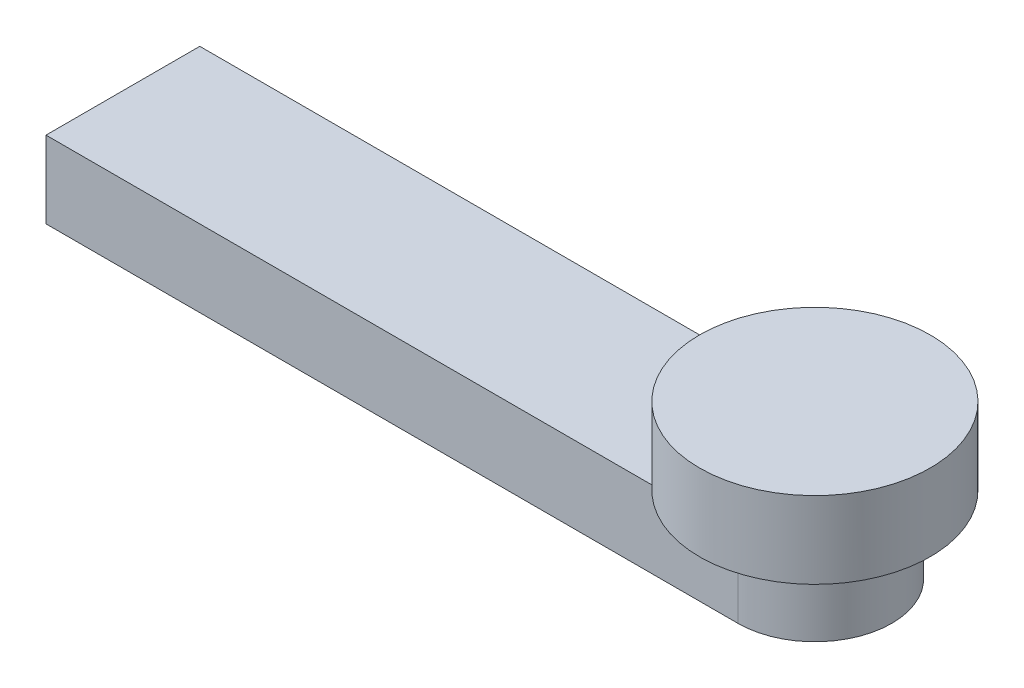
ISO-10303-21;
HEADER;
FILE_DESCRIPTION(('STEP AP214'),'2;1');
FILE_NAME('part.step','',(''),(''),'','','');
FILE_SCHEMA(('AUTOMOTIVE_DESIGN { 1 0 10303 214 1 1 1 1 }'));
ENDSEC;
DATA;
#1=APPLICATION_CONTEXT('core data for automotive mechanical design processes');
#2=APPLICATION_PROTOCOL_DEFINITION('international standard','automotive_design',2000,#1);
#3=PRODUCT_CONTEXT('',#1,'mechanical');
#4=PRODUCT('Part','Part','',(#3));
#5=PRODUCT_RELATED_PRODUCT_CATEGORY('part','',(#4));
#6=PRODUCT_DEFINITION_FORMATION('','',#4);
#7=PRODUCT_DEFINITION_CONTEXT('part definition',#1,'design');
#8=PRODUCT_DEFINITION('design','',#6,#7);
#9=PRODUCT_DEFINITION_SHAPE('','',#8);
#10=(LENGTH_UNIT() NAMED_UNIT(*) SI_UNIT(.MILLI.,.METRE.));
#11=(NAMED_UNIT(*) PLANE_ANGLE_UNIT() SI_UNIT($,.RADIAN.));
#12=(NAMED_UNIT(*) SI_UNIT($,.STERADIAN.) SOLID_ANGLE_UNIT());
#13=UNCERTAINTY_MEASURE_WITH_UNIT(LENGTH_MEASURE(1.E-05),#10,'distance_accuracy_value','');
#14=(GEOMETRIC_REPRESENTATION_CONTEXT(3) GLOBAL_UNCERTAINTY_ASSIGNED_CONTEXT((#13)) GLOBAL_UNIT_ASSIGNED_CONTEXT((#10,
#11,#12)) REPRESENTATION_CONTEXT('',''));
#15=CARTESIAN_POINT('',(0.,0.,0.));
#16=DIRECTION('',(0.,0.,1.));
#17=DIRECTION('',(1.,0.,0.));
#18=AXIS2_PLACEMENT_3D('',#15,#16,#17);
#19=CARTESIAN_POINT('',(45.,10.,0.));
#20=DIRECTION('',(0.,-1.,0.));
#21=DIRECTION('',(0.,0.,-1.));
#22=AXIS2_PLACEMENT_3D('',#19,#20,#21);
#23=CYLINDRICAL_SURFACE('',#22,10.);
#24=CARTESIAN_POINT('',(45.,0.,0.));
#25=DIRECTION('',(0.,1.,0.));
#26=DIRECTION('',(0.,0.,1.));
#27=AXIS2_PLACEMENT_3D('',#24,#25,#26);
#28=CIRCLE('',#27,10.);
#29=CARTESIAN_POINT('',(45.,0.,10.));
#30=VERTEX_POINT('',#29);
#31=CARTESIAN_POINT('',(45.,0.,-10.));
#32=VERTEX_POINT('',#31);
#33=EDGE_CURVE('E119',#30,#32,#28,.T.);
#34=ORIENTED_EDGE('',*,*,#33,.T.);
#35=DIRECTION('',(0.,-1.,0.));
#36=VECTOR('',#35,1.);
#37=CARTESIAN_POINT('',(45.,10.,-10.));
#38=LINE('',#37,#36);
#39=CARTESIAN_POINT('',(45.,10.,-10.));
#40=VERTEX_POINT('',#39);
#41=EDGE_CURVE('E11',#40,#32,#38,.T.);
#42=ORIENTED_EDGE('',*,*,#41,.F.);
#43=CARTESIAN_POINT('',(45.,10.,0.));
#44=DIRECTION('',(0.,1.,0.));
#45=DIRECTION('',(0.,0.,1.));
#46=AXIS2_PLACEMENT_3D('',#43,#44,#45);
#47=CIRCLE('',#46,10.);
#48=CARTESIAN_POINT('',(45.,10.,10.));
#49=VERTEX_POINT('',#48);
#50=EDGE_CURVE('E122',#49,#40,#47,.T.);
#51=ORIENTED_EDGE('',*,*,#50,.F.);
#52=DIRECTION('',(0.,-1.,0.));
#53=VECTOR('',#52,1.);
#54=CARTESIAN_POINT('',(45.,10.,10.));
#55=LINE('',#54,#53);
#56=EDGE_CURVE('E65',#49,#30,#55,.T.);
#57=ORIENTED_EDGE('',*,*,#56,.T.);
#58=EDGE_LOOP('',(#34,#42,#51,#57));
#59=FACE_BOUND('',#58,.T.);
#60=ADVANCED_FACE('F41',(#59),#23,.T.);
#61=CARTESIAN_POINT('',(-45.,10.,-10.));
#62=DIRECTION('',(0.,0.,1.));
#63=DIRECTION('',(1.,0.,0.));
#64=AXIS2_PLACEMENT_3D('',#61,#62,#63);
#65=PLANE('',#64);
#66=DIRECTION('',(-1.,0.,0.));
#67=VECTOR('',#66,1.);
#68=CARTESIAN_POINT('',(-45.,0.,-10.));
#69=LINE('',#68,#67);
#70=CARTESIAN_POINT('',(-45.,0.,-10.));
#71=VERTEX_POINT('',#70);
#72=EDGE_CURVE('E133',#32,#71,#69,.T.);
#73=ORIENTED_EDGE('',*,*,#72,.T.);
#74=DIRECTION('',(0.,-1.,0.));
#75=VECTOR('',#74,1.);
#76=CARTESIAN_POINT('',(-45.,10.,-10.));
#77=LINE('',#76,#75);
#78=CARTESIAN_POINT('',(-45.,10.,-10.));
#79=VERTEX_POINT('',#78);
#80=EDGE_CURVE('E49',#79,#71,#77,.T.);
#81=ORIENTED_EDGE('',*,*,#80,.F.);
#82=DIRECTION('',(-1.,0.,0.));
#83=VECTOR('',#82,1.);
#84=CARTESIAN_POINT('',(-45.,10.,-10.));
#85=LINE('',#84,#83);
#86=CARTESIAN_POINT('',(33.8196601125011,10.,-9.99999999999999));
#87=VERTEX_POINT('',#86);
#88=EDGE_CURVE('E125',#87,#79,#85,.T.);
#89=ORIENTED_EDGE('',*,*,#88,.F.);
#90=EDGE_CURVE('E90',#40,#87,#85,.T.);
#91=ORIENTED_EDGE('',*,*,#90,.F.);
#92=ORIENTED_EDGE('',*,*,#41,.T.);
#93=EDGE_LOOP('',(#73,#81,#89,#91,#92));
#94=FACE_BOUND('',#93,.T.);
#95=ADVANCED_FACE('F155',(#94),#65,.F.);
#96=CARTESIAN_POINT('',(-45.,10.,-10.));
#97=DIRECTION('',(1.,0.,0.));
#98=DIRECTION('',(0.,0.,-1.));
#99=AXIS2_PLACEMENT_3D('',#96,#97,#98);
#100=PLANE('',#99);
#101=DIRECTION('',(0.,0.,1.));
#102=VECTOR('',#101,1.);
#103=CARTESIAN_POINT('',(-45.,0.,-10.));
#104=LINE('',#103,#102);
#105=CARTESIAN_POINT('',(-45.,0.,10.));
#106=VERTEX_POINT('',#105);
#107=EDGE_CURVE('E136',#71,#106,#104,.T.);
#108=ORIENTED_EDGE('',*,*,#107,.T.);
#109=DIRECTION('',(0.,-1.,0.));
#110=VECTOR('',#109,1.);
#111=CARTESIAN_POINT('',(-45.,10.,10.));
#112=LINE('',#111,#110);
#113=CARTESIAN_POINT('',(-45.,10.,10.));
#114=VERTEX_POINT('',#113);
#115=EDGE_CURVE('E143',#114,#106,#112,.T.);
#116=ORIENTED_EDGE('',*,*,#115,.F.);
#117=DIRECTION('',(0.,0.,1.));
#118=VECTOR('',#117,1.);
#119=CARTESIAN_POINT('',(-45.,10.,-10.));
#120=LINE('',#119,#118);
#121=EDGE_CURVE('E97',#79,#114,#120,.T.);
#122=ORIENTED_EDGE('',*,*,#121,.F.);
#123=ORIENTED_EDGE('',*,*,#80,.T.);
#124=EDGE_LOOP('',(#108,#116,#122,#123));
#125=FACE_BOUND('',#124,.T.);
#126=ADVANCED_FACE('F150',(#125),#100,.F.);
#127=CARTESIAN_POINT('',(-45.,10.,10.));
#128=DIRECTION('',(0.,0.,-1.));
#129=DIRECTION('',(-1.,0.,0.));
#130=AXIS2_PLACEMENT_3D('',#127,#128,#129);
#131=PLANE('',#130);
#132=DIRECTION('',(1.,0.,0.));
#133=VECTOR('',#132,1.);
#134=CARTESIAN_POINT('',(-45.,0.,10.));
#135=LINE('',#134,#133);
#136=EDGE_CURVE('E85',#106,#30,#135,.T.);
#137=ORIENTED_EDGE('',*,*,#136,.T.);
#138=ORIENTED_EDGE('',*,*,#56,.F.);
#139=DIRECTION('',(1.,0.,0.));
#140=VECTOR('',#139,1.);
#141=CARTESIAN_POINT('',(-45.,10.,10.));
#142=LINE('',#141,#140);
#143=CARTESIAN_POINT('',(33.8196601125011,10.,10.));
#144=VERTEX_POINT('',#143);
#145=EDGE_CURVE('E100',#144,#49,#142,.T.);
#146=ORIENTED_EDGE('',*,*,#145,.F.);
#147=EDGE_CURVE('E94',#114,#144,#142,.T.);
#148=ORIENTED_EDGE('',*,*,#147,.F.);
#149=ORIENTED_EDGE('',*,*,#115,.T.);
#150=EDGE_LOOP('',(#137,#138,#146,#148,#149));
#151=FACE_BOUND('',#150,.T.);
#152=ADVANCED_FACE('F104',(#151),#131,.F.);
#153=CARTESIAN_POINT('',(45.,10.,0.));
#154=DIRECTION('',(0.,1.,0.));
#155=DIRECTION('',(0.,0.,1.));
#156=AXIS2_PLACEMENT_3D('',#153,#154,#155);
#157=PLANE('',#156);
#158=CARTESIAN_POINT('',(45.,10.,0.));
#159=DIRECTION('',(0.,1.,0.));
#160=DIRECTION('',(0.,0.,1.));
#161=AXIS2_PLACEMENT_3D('',#158,#159,#160);
#162=CIRCLE('',#161,15.);
#163=EDGE_CURVE('E56',#87,#144,#162,.T.);
#164=ORIENTED_EDGE('',*,*,#163,.F.);
#165=ORIENTED_EDGE('',*,*,#88,.T.);
#166=ORIENTED_EDGE('',*,*,#121,.T.);
#167=ORIENTED_EDGE('',*,*,#147,.T.);
#168=EDGE_LOOP('',(#164,#165,#166,#167));
#169=FACE_BOUND('',#168,.T.);
#170=ADVANCED_FACE('F95',(#169),#157,.T.);
#171=CARTESIAN_POINT('',(45.,0.,0.));
#172=DIRECTION('',(0.,1.,0.));
#173=DIRECTION('',(0.,0.,1.));
#174=AXIS2_PLACEMENT_3D('',#171,#172,#173);
#175=PLANE('',#174);
#176=ORIENTED_EDGE('',*,*,#33,.F.);
#177=ORIENTED_EDGE('',*,*,#136,.F.);
#178=ORIENTED_EDGE('',*,*,#107,.F.);
#179=ORIENTED_EDGE('',*,*,#72,.F.);
#180=EDGE_LOOP('',(#176,#177,#178,#179));
#181=FACE_BOUND('',#180,.T.);
#182=ADVANCED_FACE('F153',(#181),#175,.F.);
#183=CARTESIAN_POINT('',(45.,10.,0.));
#184=DIRECTION('',(0.,1.,0.));
#185=DIRECTION('',(0.,0.,1.));
#186=AXIS2_PLACEMENT_3D('',#183,#184,#185);
#187=PLANE('',#186);
#188=ORIENTED_EDGE('',*,*,#50,.T.);
#189=ORIENTED_EDGE('',*,*,#90,.T.);
#190=EDGE_CURVE('E109',#144,#87,#162,.T.);
#191=ORIENTED_EDGE('',*,*,#190,.F.);
#192=ORIENTED_EDGE('',*,*,#145,.T.);
#193=EDGE_LOOP('',(#188,#189,#191,#192));
#194=FACE_BOUND('',#193,.T.);
#195=ADVANCED_FACE('F110',(#194),#187,.F.);
#196=CARTESIAN_POINT('',(45.,20.,0.));
#197=DIRECTION('',(0.,-1.,0.));
#198=DIRECTION('',(0.,0.,-1.));
#199=AXIS2_PLACEMENT_3D('',#196,#197,#198);
#200=CYLINDRICAL_SURFACE('',#199,15.);
#201=CARTESIAN_POINT('',(45.,20.,0.));
#202=DIRECTION('',(0.,1.,0.));
#203=DIRECTION('',(0.,0.,1.));
#204=AXIS2_PLACEMENT_3D('',#201,#202,#203);
#205=CIRCLE('',#204,15.);
#206=CARTESIAN_POINT('',(45.,20.,15.));
#207=VERTEX_POINT('',#206);
#208=EDGE_CURVE('E116',#207,#207,#205,.T.);
#209=ORIENTED_EDGE('',*,*,#208,.F.);
#210=EDGE_LOOP('',(#209));
#211=FACE_BOUND('',#210,.T.);
#212=ORIENTED_EDGE('',*,*,#163,.T.);
#213=ORIENTED_EDGE('',*,*,#190,.T.);
#214=EDGE_LOOP('',(#212,#213));
#215=FACE_BOUND('',#214,.T.);
#216=ADVANCED_FACE('F114',(#211,#215),#200,.T.);
#217=CARTESIAN_POINT('',(45.,20.,0.));
#218=DIRECTION('',(0.,1.,0.));
#219=DIRECTION('',(0.,0.,1.));
#220=AXIS2_PLACEMENT_3D('',#217,#218,#219);
#221=PLANE('',#220);
#222=ORIENTED_EDGE('',*,*,#208,.T.);
#223=EDGE_LOOP('',(#222));
#224=FACE_BOUND('',#223,.T.);
#225=ADVANCED_FACE('F171',(#224),#221,.T.);
#226=CLOSED_SHELL('',(#60,#95,#126,#152,#170,#182,#195,#216,#225));
#227=MANIFOLD_SOLID_BREP('B2',#226);
#228=ADVANCED_BREP_SHAPE_REPRESENTATION('',(#18,#227),#14);
#229=SHAPE_DEFINITION_REPRESENTATION(#9,#228);
ENDSEC;
END-ISO-10303-21;
